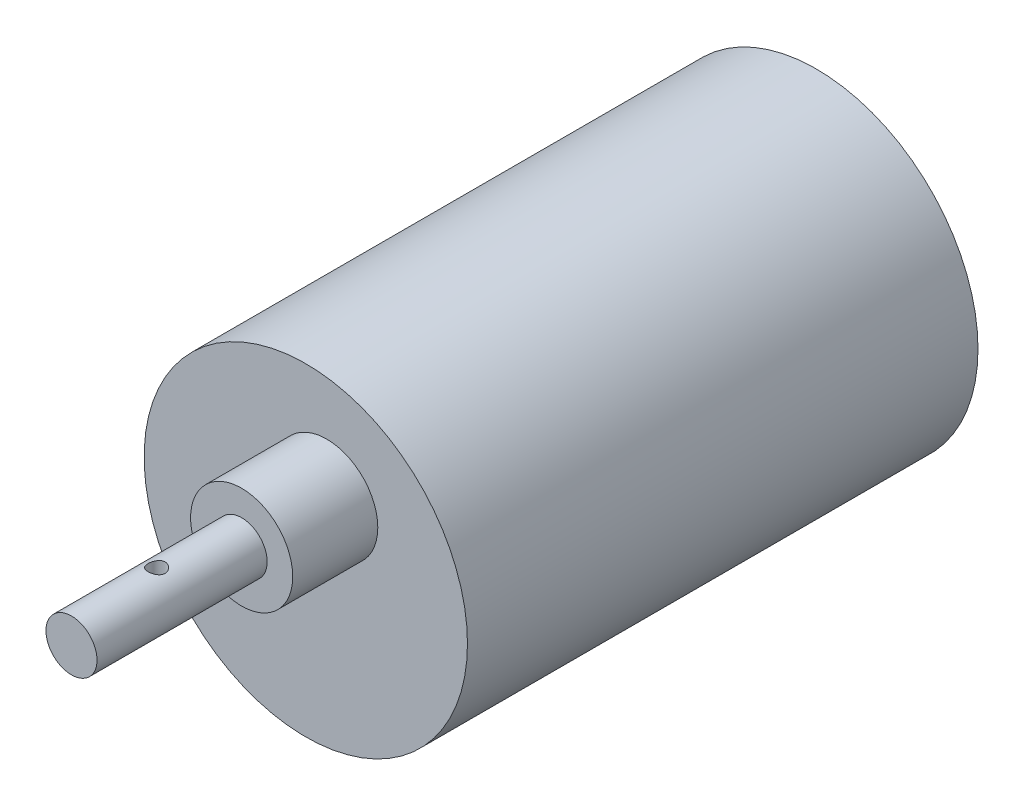
ISO-10303-21;
HEADER;
FILE_DESCRIPTION(('STEP AP214'),'2;1');
FILE_NAME('part.step','',(''),(''),'','','');
FILE_SCHEMA(('AUTOMOTIVE_DESIGN { 1 0 10303 214 1 1 1 1 }'));
ENDSEC;
DATA;
#1=APPLICATION_CONTEXT('core data for automotive mechanical design processes');
#2=APPLICATION_PROTOCOL_DEFINITION('international standard','automotive_design',2000,#1);
#3=PRODUCT_CONTEXT('',#1,'mechanical');
#4=PRODUCT('Part','Part','',(#3));
#5=PRODUCT_RELATED_PRODUCT_CATEGORY('part','',(#4));
#6=PRODUCT_DEFINITION_FORMATION('','',#4);
#7=PRODUCT_DEFINITION_CONTEXT('part definition',#1,'design');
#8=PRODUCT_DEFINITION('design','',#6,#7);
#9=PRODUCT_DEFINITION_SHAPE('','',#8);
#10=(LENGTH_UNIT() NAMED_UNIT(*) SI_UNIT(.MILLI.,.METRE.));
#11=(NAMED_UNIT(*) PLANE_ANGLE_UNIT() SI_UNIT($,.RADIAN.));
#12=(NAMED_UNIT(*) SI_UNIT($,.STERADIAN.) SOLID_ANGLE_UNIT());
#13=UNCERTAINTY_MEASURE_WITH_UNIT(LENGTH_MEASURE(1.E-05),#10,'distance_accuracy_value','');
#14=(GEOMETRIC_REPRESENTATION_CONTEXT(3) GLOBAL_UNCERTAINTY_ASSIGNED_CONTEXT((#13)) GLOBAL_UNIT_ASSIGNED_CONTEXT((#10,
#11,#12)) REPRESENTATION_CONTEXT('',''));
#15=CARTESIAN_POINT('',(0.,0.,0.));
#16=DIRECTION('',(0.,0.,1.));
#17=DIRECTION('',(1.,0.,0.));
#18=AXIS2_PLACEMENT_3D('',#15,#16,#17);
#19=CARTESIAN_POINT('',(2.45960300805931,6.55365188599041,90.));
#20=DIRECTION('',(0.,0.,-1.));
#21=DIRECTION('',(-1.,0.,0.));
#22=AXIS2_PLACEMENT_3D('',#19,#20,#21);
#23=CYLINDRICAL_SURFACE('',#22,3.);
#24=CARTESIAN_POINT('',(2.45960300805931,6.55365188599041,90.));
#25=DIRECTION('',(0.,0.,1.));
#26=DIRECTION('',(1.,0.,0.));
#27=AXIS2_PLACEMENT_3D('',#24,#25,#26);
#28=CIRCLE('',#27,3.);
#29=CARTESIAN_POINT('',(5.45960300805931,6.55365188599041,90.));
#30=VERTEX_POINT('',#29);
#31=EDGE_CURVE('E72',#30,#30,#28,.T.);
#32=ORIENTED_EDGE('',*,*,#31,.F.);
#33=EDGE_LOOP('',(#32));
#34=FACE_BOUND('',#33,.T.);
#35=CARTESIAN_POINT('',(2.45960300805931,6.55365188599041,70.));
#36=DIRECTION('',(0.,0.,1.));
#37=DIRECTION('',(1.,0.,0.));
#38=AXIS2_PLACEMENT_3D('',#35,#36,#37);
#39=CIRCLE('',#38,3.);
#40=CARTESIAN_POINT('',(5.45960300805931,6.55365188599041,70.));
#41=VERTEX_POINT('',#40);
#42=EDGE_CURVE('E12',#41,#41,#39,.T.);
#43=ORIENTED_EDGE('',*,*,#42,.T.);
#44=EDGE_LOOP('',(#43));
#45=FACE_BOUND('',#44,.T.);
#46=CARTESIAN_POINT('',(2.45960300805931,3.55365188599041,79.));
#47=CARTESIAN_POINT('',(2.51416637094603,3.55365173298097,78.9999997462684));
#48=CARTESIAN_POINT('',(2.56872820259786,3.55515419091496,79.0044802661272));
#49=CARTESIAN_POINT('',(2.67624476893228,3.5609997839576,79.0222291088172));
#50=CARTESIAN_POINT('',(2.72919933617812,3.56534321396888,79.0354983439489));
#51=CARTESIAN_POINT('',(2.83193579756108,3.57639880692598,79.070319243384));
#52=CARTESIAN_POINT('',(2.88172283394534,3.58310700868187,79.0918570624593));
#53=CARTESIAN_POINT('',(2.97697794486463,3.59820742881699,79.1425411728383));
#54=CARTESIAN_POINT('',(3.02244516501802,3.60659997931263,79.1716889650026));
#55=CARTESIAN_POINT('',(3.10934468308157,3.62451094156036,79.2378258048588));
#56=CARTESIAN_POINT('',(3.15060670835762,3.63405632135256,79.2750312342605));
#57=CARTESIAN_POINT('',(3.22643570076139,3.65304873815919,79.3557671547066));
#58=CARTESIAN_POINT('',(3.26100119354877,3.66249575308492,79.3992990349285));
#59=CARTESIAN_POINT('',(3.32342795028717,3.68051856121767,79.4929851151964));
#60=CARTESIAN_POINT('',(3.35106786628034,3.68906149323353,79.5432937397321));
#61=CARTESIAN_POINT('',(3.39742188193703,3.7038988318044,79.6481760944585));
#62=CARTESIAN_POINT('',(3.41613870544607,3.71019392438295,79.7027485171627));
#63=CARTESIAN_POINT('',(3.44347646956847,3.71953885329663,79.8126732214967));
#64=CARTESIAN_POINT('',(3.45241645633108,3.72269092829429,79.8679372084891));
#65=CARTESIAN_POINT('',(3.46094413139378,3.72569531969533,79.9792637541559));
#66=CARTESIAN_POINT('',(3.46053470966402,3.72554865576311,80.0353260607092));
#67=CARTESIAN_POINT('',(3.45062291176272,3.72206173590861,80.143936630444));
#68=CARTESIAN_POINT('',(3.4415369212263,3.71886772731508,80.196528402919));
#69=CARTESIAN_POINT('',(3.41520917090872,3.7098853087449,80.2993934196068));
#70=CARTESIAN_POINT('',(3.39796643465118,3.70409658814933,80.3496663854351));
#71=CARTESIAN_POINT('',(3.35554206611952,3.69047277467792,80.4474127495915));
#72=CARTESIAN_POINT('',(3.33023705676657,3.68260622805923,80.4948280254695));
#73=CARTESIAN_POINT('',(3.27249211436244,3.66572630023314,80.5848709082797));
#74=CARTESIAN_POINT('',(3.24005012042331,3.65671258808577,80.6274971269334));
#75=CARTESIAN_POINT('',(3.16695234074155,3.637978594313,80.7090915981608));
#76=CARTESIAN_POINT('',(3.12595615813562,3.62824599244198,80.7477526945091));
#77=CARTESIAN_POINT('',(3.03794257802937,3.60958250212004,80.8177312666634));
#78=CARTESIAN_POINT('',(2.99092460372012,3.60065169060973,80.8490480381645));
#79=CARTESIAN_POINT('',(2.89155062110557,3.58448080661247,80.9036963002351));
#80=CARTESIAN_POINT('',(2.83914628447564,3.57725838591001,80.9269454913407));
#81=CARTESIAN_POINT('',(2.73087209142381,3.56544621454606,80.9642031739557));
#82=CARTESIAN_POINT('',(2.67500344621426,3.56085554944162,80.9782148754234));
#83=CARTESIAN_POINT('',(2.56398683758861,3.554975615276,80.9960556660224));
#84=CARTESIAN_POINT('',(2.50891260792415,3.5535518676531,81.0002998091727));
#85=CARTESIAN_POINT('',(2.39882793809907,3.55376285904216,80.9996673264015));
#86=CARTESIAN_POINT('',(2.34381748873966,3.55539708179688,80.9947922400201));
#87=CARTESIAN_POINT('',(2.23708314175505,3.56145163881927,80.976388092264));
#88=CARTESIAN_POINT('',(2.18531020122445,3.56578989887812,80.9631137939505));
#89=CARTESIAN_POINT('',(2.08474704947974,3.57673341769007,80.9286065555333));
#90=CARTESIAN_POINT('',(2.03595721955074,3.583338965525,80.9073726005323));
#91=CARTESIAN_POINT('',(1.94131471166598,3.59836257311613,80.8569295681591));
#92=CARTESIAN_POINT('',(1.89557304884198,3.60682373842735,80.8275254067164));
#93=CARTESIAN_POINT('',(1.80953817792391,3.62459934683297,80.7618058499869));
#94=CARTESIAN_POINT('',(1.76924664026441,3.63391405007153,80.7254883439699));
#95=CARTESIAN_POINT('',(1.69335050025229,3.65288340616568,80.6450212489917));
#96=CARTESIAN_POINT('',(1.65804203881082,3.66253427503885,80.6005907730668));
#97=CARTESIAN_POINT('',(1.59534548573846,3.68065215312059,80.5062284321955));
#98=CARTESIAN_POINT('',(1.56795746013846,3.68911915245921,80.4562965213898));
#99=CARTESIAN_POINT('',(1.52200607763595,3.70382796778733,80.3523269846934));
#100=CARTESIAN_POINT('',(1.50342487586154,3.71007427698409,80.2982979207572));
#101=CARTESIAN_POINT('',(1.47570834126715,3.71954356199907,80.1876213498759));
#102=CARTESIAN_POINT('',(1.46656875309806,3.72276789976342,80.130975034567));
#103=CARTESIAN_POINT('',(1.45832672558892,3.7256732972397,80.0198029039868));
#104=CARTESIAN_POINT('',(1.45873275074838,3.72552788254742,79.9653176597483));
#105=CARTESIAN_POINT('',(1.46836071460443,3.72213918675481,79.8572349251003));
#106=CARTESIAN_POINT('',(1.47758212860042,3.71889609003156,79.8036373820471));
#107=CARTESIAN_POINT('',(1.50423119493232,3.70980664320097,79.6998643369873));
#108=CARTESIAN_POINT('',(1.52149966204443,3.70401090583527,79.6496431749928));
#109=CARTESIAN_POINT('',(1.56362364229893,3.69048789773607,79.5527725930644));
#110=CARTESIAN_POINT('',(1.58848083950533,3.68276019833744,79.5061239688127));
#111=CARTESIAN_POINT('',(1.64634231547606,3.66582359374981,79.4155163300763));
#112=CARTESIAN_POINT('',(1.67965476529478,3.65656476957437,79.3717634981014));
#113=CARTESIAN_POINT('',(1.75296012492361,3.63781832315255,79.290310186616));
#114=CARTESIAN_POINT('',(1.79295492360781,3.62833063686523,79.252611424312));
#115=CARTESIAN_POINT('',(1.88036145113863,3.60975158073648,79.1828555877108));
#116=CARTESIAN_POINT('',(1.92800149455958,3.60069006797824,79.151075652249));
#117=CARTESIAN_POINT('',(2.02824565065268,3.58439197426388,79.0960095711494));
#118=CARTESIAN_POINT('',(2.08084848992695,3.577154926911,79.072721254078));
#119=CARTESIAN_POINT('',(2.18710936085833,3.56559673530509,79.0362783675113));
#120=CARTESIAN_POINT('',(2.2406152503829,3.56115976176521,79.0227175337366));
#121=CARTESIAN_POINT('',(2.34928259204906,3.55518781534816,79.0045797193229));
#122=CARTESIAN_POINT('',(2.40444358249056,3.55365204067135,79.0000002565035));
#123=CARTESIAN_POINT('',(2.45960300805931,3.55365188599041,79.));
#124=B_SPLINE_CURVE_WITH_KNOTS('',3,(#46,#47,#48,#49,#50,#51,#52,#53,#54,#55,#56,#57,#58,#59,
#60,#61,#62,#63,#64,#65,#66,#67,#68,#69,#70,#71,#72,#73,#74,#75,#76,#77,#78,#79,#80,#81,#82,#83,
#84,#85,#86,#87,#88,#89,#90,#91,#92,#93,#94,#95,#96,#97,#98,#99,#100,#101,#102,#103,#104,#105,
#106,#107,#108,#109,#110,#111,#112,#113,#114,#115,#116,#117,#118,#119,#120,#121,#122,#123),
.UNSPECIFIED.,.T.,.F.,(4,2,2,2,2,2,2,2,2,2,2,2,2,2,2,2,2,2,2,2,2,2,2,2,2,2,2,2,2,2,2,2,2,2,2,2,
2,2,4),(0.,0.163487106026009,0.326991185267522,0.490222672870277,0.653486377799102,
0.821846842827565,0.990244332875301,1.16348384823471,1.33667044692833,1.50401925741841,
1.67131633987486,1.83096826551281,1.99063930855482,2.15288171155131,2.31517102558207,
2.48593305811367,2.65671145966619,2.82918405650358,3.00159668877209,3.1665358317517,
3.33144713164177,3.49158157978214,3.65173645284104,3.81610399843737,3.98052180821892,
4.15241022880752,4.32430008234997,4.49584013824415,4.66730284700845,4.8299566605662,
4.99260079341185,5.1521558707023,5.3117463816579,5.47830066681617,5.64490211113589,
5.81799660824912,5.99104681142267,6.15636558363625,6.32163866027951),.UNSPECIFIED.);
#125=CARTESIAN_POINT('',(2.45960300805931,3.55365188599041,79.));
#126=VERTEX_POINT('',#125);
#127=EDGE_CURVE('E83',#126,#126,#124,.T.);
#128=ORIENTED_EDGE('',*,*,#127,.F.);
#129=EDGE_LOOP('',(#128));
#130=FACE_BOUND('',#129,.T.);
#131=CARTESIAN_POINT('',(2.45960300805931,9.55365188599041,79.));
#132=CARTESIAN_POINT('',(2.40503964517258,9.55365203899984,78.9999997462684));
#133=CARTESIAN_POINT('',(2.35047781352076,9.55214958106585,79.0044802661272));
#134=CARTESIAN_POINT('',(2.24296124718633,9.54630398802322,79.0222291088172));
#135=CARTESIAN_POINT('',(2.19000667994049,9.54196055801193,79.0354983439489));
#136=CARTESIAN_POINT('',(2.08727021855753,9.53090496505483,79.070319243384));
#137=CARTESIAN_POINT('',(2.03748318217327,9.52419676329894,79.0918570624593));
#138=CARTESIAN_POINT('',(1.94222807125398,9.50909634316382,79.1425411728383));
#139=CARTESIAN_POINT('',(1.8967608511006,9.50070379266818,79.1716889650026));
#140=CARTESIAN_POINT('',(1.80986133303704,9.48279283042046,79.2378258048588));
#141=CARTESIAN_POINT('',(1.76859930776099,9.47324745062825,79.2750312342605));
#142=CARTESIAN_POINT('',(1.69277031535722,9.45425503382162,79.3557671547066));
#143=CARTESIAN_POINT('',(1.65820482256984,9.4448080188959,79.3992990349285));
#144=CARTESIAN_POINT('',(1.59577806583145,9.42678521076314,79.4929851151964));
#145=CARTESIAN_POINT('',(1.56813814983827,9.41824227874729,79.5432937397321));
#146=CARTESIAN_POINT('',(1.52178413418158,9.40340494017642,79.6481760944585));
#147=CARTESIAN_POINT('',(1.50306731067254,9.39710984759786,79.7027485171627));
#148=CARTESIAN_POINT('',(1.47572954655014,9.38776491868418,79.8126732214967));
#149=CARTESIAN_POINT('',(1.46678955978754,9.38461284368652,79.8679372084891));
#150=CARTESIAN_POINT('',(1.45826188472483,9.38160845228548,79.9792637541559));
#151=CARTESIAN_POINT('',(1.45867130645459,9.38175511621771,80.0353260607092));
#152=CARTESIAN_POINT('',(1.46858310435589,9.38524203607221,80.143936630444));
#153=CARTESIAN_POINT('',(1.47766909489231,9.38843604466574,80.196528402919));
#154=CARTESIAN_POINT('',(1.50399684520989,9.39741846323592,80.2993934196068));
#155=CARTESIAN_POINT('',(1.52123958146743,9.40320718383148,80.3496663854351));
#156=CARTESIAN_POINT('',(1.56366394999909,9.41683099730289,80.4474127495915));
#157=CARTESIAN_POINT('',(1.58896895935205,9.42469754392158,80.4948280254695));
#158=CARTESIAN_POINT('',(1.64671390175617,9.44157747174767,80.5848709082797));
#159=CARTESIAN_POINT('',(1.6791558956953,9.45059118389504,80.6274971269334));
#160=CARTESIAN_POINT('',(1.75225367537706,9.46932517766781,80.7090915981608));
#161=CARTESIAN_POINT('',(1.79324985798299,9.47905777953883,80.7477526945091));
#162=CARTESIAN_POINT('',(1.88126343808924,9.49772126986077,80.8177312666634));
#163=CARTESIAN_POINT('',(1.92828141239849,9.50665208137108,80.8490480381645));
#164=CARTESIAN_POINT('',(2.02765539501304,9.52282296536834,80.9036963002351));
#165=CARTESIAN_POINT('',(2.08005973164297,9.5300453860708,80.9269454913407));
#166=CARTESIAN_POINT('',(2.1883339246948,9.54185755743475,80.9642031739557));
#167=CARTESIAN_POINT('',(2.24420256990435,9.54644822253919,80.9782148754234));
#168=CARTESIAN_POINT('',(2.35521917853,9.55232815670482,80.9960556660224));
#169=CARTESIAN_POINT('',(2.41029340819446,9.55375190432772,81.0002998091727));
#170=CARTESIAN_POINT('',(2.52037807801954,9.55354091293865,80.9996673264015));
#171=CARTESIAN_POINT('',(2.57538852737895,9.55190669018393,80.9947922400201));
#172=CARTESIAN_POINT('',(2.68212287436356,9.54585213316155,80.976388092264));
#173=CARTESIAN_POINT('',(2.73389581489416,9.54151387310269,80.9631137939505));
#174=CARTESIAN_POINT('',(2.83445896663887,9.53057035429075,80.9286065555333));
#175=CARTESIAN_POINT('',(2.88324879656787,9.52396480645582,80.9073726005323));
#176=CARTESIAN_POINT('',(2.97789130445263,9.50894119886468,80.8569295681591));
#177=CARTESIAN_POINT('',(3.02363296727663,9.50048003355346,80.8275254067164));
#178=CARTESIAN_POINT('',(3.10966783819471,9.48270442514784,80.7618058499869));
#179=CARTESIAN_POINT('',(3.1499593758542,9.47338972190929,80.7254883439699));
#180=CARTESIAN_POINT('',(3.22585551586632,9.45442036581513,80.6450212489917));
#181=CARTESIAN_POINT('',(3.26116397730779,9.44476949694196,80.6005907730668));
#182=CARTESIAN_POINT('',(3.32386053038015,9.42665161886022,80.5062284321955));
#183=CARTESIAN_POINT('',(3.35124855598015,9.4181846195216,80.4562965213898));
#184=CARTESIAN_POINT('',(3.39719993848267,9.40347580419349,80.3523269846934));
#185=CARTESIAN_POINT('',(3.41578114025707,9.39722949499672,80.2982979207572));
#186=CARTESIAN_POINT('',(3.44349767485147,9.38776020998174,80.1876213498759));
#187=CARTESIAN_POINT('',(3.45263726302055,9.38453587221739,80.1309750345669));
#188=CARTESIAN_POINT('',(3.46087929052969,9.38163047474112,80.0198029039868));
#189=CARTESIAN_POINT('',(3.46047326537023,9.3817758894334,79.9653176597483));
#190=CARTESIAN_POINT('',(3.45084530151418,9.38516458522601,79.8572349251003));
#191=CARTESIAN_POINT('',(3.44162388751819,9.38840768194925,79.8036373820471));
#192=CARTESIAN_POINT('',(3.41497482118629,9.39749712877984,79.6998643369873));
#193=CARTESIAN_POINT('',(3.39770635407418,9.40329286614555,79.6496431749928));
#194=CARTESIAN_POINT('',(3.35558237381968,9.41681587424474,79.5527725930644));
#195=CARTESIAN_POINT('',(3.33072517661328,9.42454357364337,79.5061239688127));
#196=CARTESIAN_POINT('',(3.27286370064255,9.44148017823101,79.4155163300763));
#197=CARTESIAN_POINT('',(3.23955125082383,9.45073900240645,79.3717634981014));
#198=CARTESIAN_POINT('',(3.166245891195,9.46948544882827,79.290310186616));
#199=CARTESIAN_POINT('',(3.1262510925108,9.47897313511558,79.252611424312));
#200=CARTESIAN_POINT('',(3.03884456497998,9.49755219124434,79.1828555877108));
#201=CARTESIAN_POINT('',(2.99120452155903,9.50661370400257,79.151075652249));
#202=CARTESIAN_POINT('',(2.89096036546594,9.52291179771693,79.0960095711494));
#203=CARTESIAN_POINT('',(2.83835752619166,9.53014884506981,79.072721254078));
#204=CARTESIAN_POINT('',(2.73209665526028,9.54170703667572,79.0362783675113));
#205=CARTESIAN_POINT('',(2.67859076573572,9.54614401021561,79.0227175337366));
#206=CARTESIAN_POINT('',(2.56992342406955,9.55211595663265,79.0045797193229));
#207=CARTESIAN_POINT('',(2.51476243362805,9.55365173130946,79.0000002565035));
#208=CARTESIAN_POINT('',(2.45960300805931,9.55365188599041,79.));
#209=B_SPLINE_CURVE_WITH_KNOTS('',3,(#131,#132,#133,#134,#135,#136,#137,#138,#139,#140,#141,
#142,#143,#144,#145,#146,#147,#148,#149,#150,#151,#152,#153,#154,#155,#156,#157,#158,#159,#160,
#161,#162,#163,#164,#165,#166,#167,#168,#169,#170,#171,#172,#173,#174,#175,#176,#177,#178,#179,
#180,#181,#182,#183,#184,#185,#186,#187,#188,#189,#190,#191,#192,#193,#194,#195,#196,#197,#198,
#199,#200,#201,#202,#203,#204,#205,#206,#207,#208),.UNSPECIFIED.,.T.,.F.,(4,2,2,2,2,2,2,2,2,2,2,
2,2,2,2,2,2,2,2,2,2,2,2,2,2,2,2,2,2,2,2,2,2,2,2,2,2,2,4),(0.,0.163487106026009,
0.326991185267522,0.490222672870277,0.653486377799102,0.821846842827565,0.990244332875301,
1.16348384823469,1.33667044692833,1.5040192574184,1.67131633987486,1.83096826551281,
1.99063930855482,2.15288171155131,2.31517102558207,2.48593305811366,2.65671145966619,
2.82918405650358,3.00159668877209,3.1665358317517,3.33144713164177,3.49158157978213,
3.65173645284104,3.81610399843737,3.98052180821891,4.15241022880751,4.32430008234997,
4.49584013824418,4.66730284700845,4.8299566605662,4.99260079341185,5.1521558707023,
5.31174638165789,5.47830066681616,5.64490211113589,5.81799660824911,5.99104681142267,
6.15636558363625,6.32163866027951),.UNSPECIFIED.);
#210=CARTESIAN_POINT('',(2.45960300805931,9.55365188599041,79.));
#211=VERTEX_POINT('',#210);
#212=EDGE_CURVE('E52',#211,#211,#209,.T.);
#213=ORIENTED_EDGE('',*,*,#212,.F.);
#214=EDGE_LOOP('',(#213));
#215=FACE_BOUND('',#214,.T.);
#216=ADVANCED_FACE('F48',(#34,#45,#130,#215),#23,.T.);
#217=CARTESIAN_POINT('',(0.,0.,60.));
#218=DIRECTION('',(0.,0.,-1.));
#219=DIRECTION('',(-1.,0.,0.));
#220=AXIS2_PLACEMENT_3D('',#217,#218,#219);
#221=CYLINDRICAL_SURFACE('',#220,19.);
#222=CARTESIAN_POINT('',(0.,0.,60.));
#223=DIRECTION('',(0.,0.,1.));
#224=DIRECTION('',(1.,0.,0.));
#225=AXIS2_PLACEMENT_3D('',#222,#223,#224);
#226=CIRCLE('',#225,19.);
#227=CARTESIAN_POINT('',(19.,0.,60.));
#228=VERTEX_POINT('',#227);
#229=EDGE_CURVE('E62',#228,#228,#226,.T.);
#230=ORIENTED_EDGE('',*,*,#229,.F.);
#231=EDGE_LOOP('',(#230));
#232=FACE_BOUND('',#231,.T.);
#233=CARTESIAN_POINT('',(0.,0.,0.));
#234=DIRECTION('',(0.,0.,1.));
#235=DIRECTION('',(1.,0.,0.));
#236=AXIS2_PLACEMENT_3D('',#233,#234,#235);
#237=CIRCLE('',#236,19.);
#238=CARTESIAN_POINT('',(19.,0.,0.));
#239=VERTEX_POINT('',#238);
#240=EDGE_CURVE('E68',#239,#239,#237,.T.);
#241=ORIENTED_EDGE('',*,*,#240,.T.);
#242=EDGE_LOOP('',(#241));
#243=FACE_BOUND('',#242,.T.);
#244=ADVANCED_FACE('F50',(#232,#243),#221,.T.);
#245=CARTESIAN_POINT('',(0.,0.,60.));
#246=DIRECTION('',(0.,0.,1.));
#247=DIRECTION('',(1.,0.,0.));
#248=AXIS2_PLACEMENT_3D('',#245,#246,#247);
#249=PLANE('',#248);
#250=CARTESIAN_POINT('',(2.45960300805931,6.55365188599041,60.));
#251=DIRECTION('',(0.,0.,1.));
#252=DIRECTION('',(1.,0.,0.));
#253=AXIS2_PLACEMENT_3D('',#250,#251,#252);
#254=CIRCLE('',#253,6.);
#255=CARTESIAN_POINT('',(8.45960300805931,6.55365188599041,60.));
#256=VERTEX_POINT('',#255);
#257=EDGE_CURVE('E77',#256,#256,#254,.T.);
#258=ORIENTED_EDGE('',*,*,#257,.F.);
#259=EDGE_LOOP('',(#258));
#260=FACE_BOUND('',#259,.T.);
#261=ORIENTED_EDGE('',*,*,#229,.T.);
#262=EDGE_LOOP('',(#261));
#263=FACE_BOUND('',#262,.T.);
#264=ADVANCED_FACE('F112',(#260,#263),#249,.T.);
#265=CARTESIAN_POINT('',(0.,0.,0.));
#266=DIRECTION('',(0.,0.,1.));
#267=DIRECTION('',(1.,0.,0.));
#268=AXIS2_PLACEMENT_3D('',#265,#266,#267);
#269=PLANE('',#268);
#270=ORIENTED_EDGE('',*,*,#240,.F.);
#271=EDGE_LOOP('',(#270));
#272=FACE_BOUND('',#271,.T.);
#273=ADVANCED_FACE('F126',(#272),#269,.F.);
#274=CARTESIAN_POINT('',(2.45960300805931,6.55365188599041,70.));
#275=DIRECTION('',(0.,0.,-1.));
#276=DIRECTION('',(-1.,0.,0.));
#277=AXIS2_PLACEMENT_3D('',#274,#275,#276);
#278=CYLINDRICAL_SURFACE('',#277,6.);
#279=CARTESIAN_POINT('',(2.45960300805931,6.55365188599041,70.));
#280=DIRECTION('',(0.,0.,1.));
#281=DIRECTION('',(1.,0.,0.));
#282=AXIS2_PLACEMENT_3D('',#279,#280,#281);
#283=CIRCLE('',#282,6.);
#284=CARTESIAN_POINT('',(8.45960300805931,6.55365188599041,70.));
#285=VERTEX_POINT('',#284);
#286=EDGE_CURVE('E73',#285,#285,#283,.T.);
#287=ORIENTED_EDGE('',*,*,#286,.F.);
#288=EDGE_LOOP('',(#287));
#289=FACE_BOUND('',#288,.T.);
#290=ORIENTED_EDGE('',*,*,#257,.T.);
#291=EDGE_LOOP('',(#290));
#292=FACE_BOUND('',#291,.T.);
#293=ADVANCED_FACE('F104',(#289,#292),#278,.T.);
#294=CARTESIAN_POINT('',(2.45960300805931,6.55365188599041,70.));
#295=DIRECTION('',(0.,0.,1.));
#296=DIRECTION('',(1.,0.,0.));
#297=AXIS2_PLACEMENT_3D('',#294,#295,#296);
#298=PLANE('',#297);
#299=ORIENTED_EDGE('',*,*,#42,.F.);
#300=EDGE_LOOP('',(#299));
#301=FACE_BOUND('',#300,.T.);
#302=ORIENTED_EDGE('',*,*,#286,.T.);
#303=EDGE_LOOP('',(#302));
#304=FACE_BOUND('',#303,.T.);
#305=ADVANCED_FACE('F99',(#301,#304),#298,.T.);
#306=CARTESIAN_POINT('',(2.45960300805931,6.55365188599041,90.));
#307=DIRECTION('',(0.,0.,1.));
#308=DIRECTION('',(1.,0.,0.));
#309=AXIS2_PLACEMENT_3D('',#306,#307,#308);
#310=PLANE('',#309);
#311=ORIENTED_EDGE('',*,*,#31,.T.);
#312=EDGE_LOOP('',(#311));
#313=FACE_BOUND('',#312,.T.);
#314=ADVANCED_FACE('F95',(#313),#310,.T.);
#315=CARTESIAN_POINT('',(2.45960300805931,20.,80.));
#316=DIRECTION('',(0.,-1.,0.));
#317=DIRECTION('',(0.,0.,-1.));
#318=AXIS2_PLACEMENT_3D('',#315,#316,#317);
#319=CYLINDRICAL_SURFACE('',#318,1.);
#320=ORIENTED_EDGE('',*,*,#127,.T.);
#321=EDGE_LOOP('',(#320));
#322=FACE_BOUND('',#321,.T.);
#323=ORIENTED_EDGE('',*,*,#212,.T.);
#324=EDGE_LOOP('',(#323));
#325=FACE_BOUND('',#324,.T.);
#326=ADVANCED_FACE('F92',(#322,#325),#319,.F.);
#327=CLOSED_SHELL('',(#216,#244,#264,#273,#293,#305,#314,#326));
#328=MANIFOLD_SOLID_BREP('B2',#327);
#329=ADVANCED_BREP_SHAPE_REPRESENTATION('',(#18,#328),#14);
#330=SHAPE_DEFINITION_REPRESENTATION(#9,#329);
ENDSEC;
END-ISO-10303-21;
